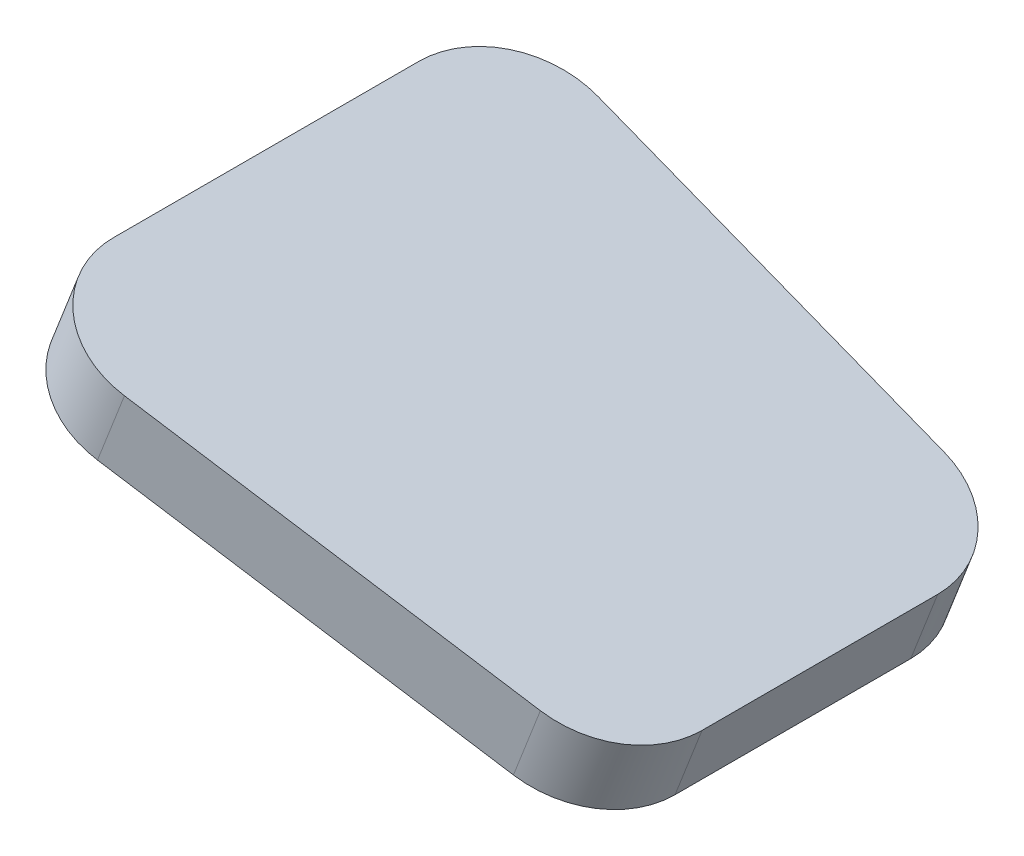
ISO-10303-21;
HEADER;
FILE_DESCRIPTION(('STEP AP214'),'2;1');
FILE_NAME('part.step','',(''),(''),'','','');
FILE_SCHEMA(('AUTOMOTIVE_DESIGN { 1 0 10303 214 1 1 1 1 }'));
ENDSEC;
DATA;
#1=APPLICATION_CONTEXT('core data for automotive mechanical design processes');
#2=APPLICATION_PROTOCOL_DEFINITION('international standard','automotive_design',2000,#1);
#3=PRODUCT_CONTEXT('',#1,'mechanical');
#4=PRODUCT('Part','Part','',(#3));
#5=PRODUCT_RELATED_PRODUCT_CATEGORY('part','',(#4));
#6=PRODUCT_DEFINITION_FORMATION('','',#4);
#7=PRODUCT_DEFINITION_CONTEXT('part definition',#1,'design');
#8=PRODUCT_DEFINITION('design','',#6,#7);
#9=PRODUCT_DEFINITION_SHAPE('','',#8);
#10=(LENGTH_UNIT() NAMED_UNIT(*) SI_UNIT(.MILLI.,.METRE.));
#11=(NAMED_UNIT(*) PLANE_ANGLE_UNIT() SI_UNIT($,.RADIAN.));
#12=(NAMED_UNIT(*) SI_UNIT($,.STERADIAN.) SOLID_ANGLE_UNIT());
#13=UNCERTAINTY_MEASURE_WITH_UNIT(LENGTH_MEASURE(1.E-05),#10,'distance_accuracy_value','');
#14=(GEOMETRIC_REPRESENTATION_CONTEXT(3) GLOBAL_UNCERTAINTY_ASSIGNED_CONTEXT((#13)) GLOBAL_UNIT_ASSIGNED_CONTEXT((#10,
#11,#12)) REPRESENTATION_CONTEXT('',''));
#15=CARTESIAN_POINT('',(0.,0.,0.));
#16=DIRECTION('',(0.,0.,1.));
#17=DIRECTION('',(1.,0.,0.));
#18=AXIS2_PLACEMENT_3D('',#15,#16,#17);
#19=CARTESIAN_POINT('',(-64.4236255865261,13.3464963099591,49.3421924891671));
#20=DIRECTION('',(-0.363059071754713,-0.931766124312644,0.));
#21=DIRECTION('',(0.931766124312644,-0.363059071754713,0.));
#22=AXIS2_PLACEMENT_3D('',#19,#20,#21);
#23=CYLINDRICAL_SURFACE('',#22,3.175);
#24=CARTESIAN_POINT('',(-65.3457956287831,10.979810354205,49.3421924891671));
#25=DIRECTION('',(0.363059071754713,0.931766124312644,0.));
#26=DIRECTION('',(-0.931766124312644,0.363059071754713,0.));
#27=AXIS2_PLACEMENT_3D('',#24,#25,#26);
#28=CIRCLE('',#27,3.175);
#29=CARTESIAN_POINT('',(-68.3041530734757,12.1325229070262,49.3421924891671));
#30=VERTEX_POINT('',#29);
#31=CARTESIAN_POINT('',(-64.7974936768709,10.7661666162451,52.4621838870334));
#32=VERTEX_POINT('',#31);
#33=EDGE_CURVE('E128',#30,#32,#28,.T.);
#34=ORIENTED_EDGE('',*,*,#33,.T.);
#35=DIRECTION('',(-0.363059071754713,-0.931766124312644,0.));
#36=VECTOR('',#35,1.);
#37=CARTESIAN_POINT('',(-63.8753236346139,13.1328525719993,52.4621838870334));
#38=LINE('',#37,#36);
#39=CARTESIAN_POINT('',(-63.8753236346139,13.1328525719993,52.4621838870334));
#40=VERTEX_POINT('',#39);
#41=EDGE_CURVE('E11',#40,#32,#38,.T.);
#42=ORIENTED_EDGE('',*,*,#41,.F.);
#43=CARTESIAN_POINT('',(-64.4236255865261,13.3464963099591,49.3421924891671));
#44=DIRECTION('',(0.363059071754713,0.931766124312644,0.));
#45=DIRECTION('',(-0.931766124312644,0.363059071754713,0.));
#46=AXIS2_PLACEMENT_3D('',#43,#44,#45);
#47=CIRCLE('',#46,3.175);
#48=CARTESIAN_POINT('',(-67.3819830312187,14.4992088627804,49.3421924891671));
#49=VERTEX_POINT('',#48);
#50=EDGE_CURVE('E142',#49,#40,#47,.T.);
#51=ORIENTED_EDGE('',*,*,#50,.F.);
#52=DIRECTION('',(-0.363059071754713,-0.931766124312644,0.));
#53=VECTOR('',#52,1.);
#54=CARTESIAN_POINT('',(-67.3819830312187,14.4992088627804,49.3421924891671));
#55=LINE('',#54,#53);
#56=EDGE_CURVE('E124',#49,#30,#55,.T.);
#57=ORIENTED_EDGE('',*,*,#56,.T.);
#58=EDGE_LOOP('',(#34,#42,#51,#57));
#59=FACE_BOUND('',#58,.T.);
#60=ADVANCED_FACE('F32',(#59),#23,.T.);
#61=CARTESIAN_POINT('',(-63.8753236346139,13.1328525719993,52.4621838870334));
#62=DIRECTION('',(-0.172693528161326,0.0672893662865768,-0.982674456020886));
#63=DIRECTION('',(-0.984906745104171,0.,0.173085826826776));
#64=AXIS2_PLACEMENT_3D('',#61,#62,#63);
#65=PLANE('',#64);
#66=DIRECTION('',(0.915622769347617,-0.35676887584001,-0.185339994291723));
#67=VECTOR('',#66,1.);
#68=CARTESIAN_POINT('',(-64.7974936768709,10.7661666162451,52.4621838870334));
#69=LINE('',#68,#67);
#70=CARTESIAN_POINT('',(-52.9640638981002,6.15531640496028,50.0668657701505));
#71=VERTEX_POINT('',#70);
#72=EDGE_CURVE('E131',#32,#71,#69,.T.);
#73=ORIENTED_EDGE('',*,*,#72,.T.);
#74=DIRECTION('',(-0.363059071754713,-0.931766124312644,0.));
#75=VECTOR('',#74,1.);
#76=CARTESIAN_POINT('',(-52.0418938558433,8.52200236071439,50.0668657701505));
#77=LINE('',#76,#75);
#78=CARTESIAN_POINT('',(-52.0418938558433,8.52200236071439,50.0668657701505));
#79=VERTEX_POINT('',#78);
#80=EDGE_CURVE('E40',#79,#71,#77,.T.);
#81=ORIENTED_EDGE('',*,*,#80,.F.);
#82=DIRECTION('',(0.915622769347617,-0.35676887584001,-0.185339994291723));
#83=VECTOR('',#82,1.);
#84=CARTESIAN_POINT('',(-63.8753236346139,13.1328525719993,52.4621838870334));
#85=LINE('',#84,#83);
#86=EDGE_CURVE('E91',#40,#79,#85,.T.);
#87=ORIENTED_EDGE('',*,*,#86,.F.);
#88=ORIENTED_EDGE('',*,*,#41,.T.);
#89=EDGE_LOOP('',(#73,#81,#87,#88));
#90=FACE_BOUND('',#89,.T.);
#91=ADVANCED_FACE('F177',(#90),#65,.F.);
#92=CARTESIAN_POINT('',(-52.5901958077555,8.73564609867428,46.9468743722842));
#93=DIRECTION('',(-0.363059071754713,-0.931766124312644,0.));
#94=DIRECTION('',(0.931766124312644,-0.363059071754713,0.));
#95=AXIS2_PLACEMENT_3D('',#92,#93,#94);
#96=CYLINDRICAL_SURFACE('',#95,3.17500000000001);
#97=CARTESIAN_POINT('',(-53.5123658500125,6.36896014292016,46.9468743722842));
#98=DIRECTION('',(0.363059071754713,0.931766124312644,0.));
#99=DIRECTION('',(-0.931766124312644,0.363059071754713,0.));
#100=AXIS2_PLACEMENT_3D('',#97,#98,#99);
#101=CIRCLE('',#100,3.17500000000001);
#102=CARTESIAN_POINT('',(-50.5540084053198,5.21624759009895,46.9468743722842));
#103=VERTEX_POINT('',#102);
#104=EDGE_CURVE('E133',#71,#103,#101,.T.);
#105=ORIENTED_EDGE('',*,*,#104,.T.);
#106=DIRECTION('',(-0.363059071754713,-0.931766124312644,0.));
#107=VECTOR('',#106,1.);
#108=CARTESIAN_POINT('',(-49.6318383630628,7.58293354585306,46.9468743722842));
#109=LINE('',#108,#107);
#110=CARTESIAN_POINT('',(-49.6318383630628,7.58293354585306,46.9468743722842));
#111=VERTEX_POINT('',#110);
#112=EDGE_CURVE('E149',#111,#103,#109,.T.);
#113=ORIENTED_EDGE('',*,*,#112,.F.);
#114=CARTESIAN_POINT('',(-52.5901958077555,8.73564609867428,46.9468743722842));
#115=DIRECTION('',(0.363059071754713,0.931766124312644,0.));
#116=DIRECTION('',(-0.931766124312644,0.363059071754713,0.));
#117=AXIS2_PLACEMENT_3D('',#114,#115,#116);
#118=CIRCLE('',#117,3.17500000000001);
#119=EDGE_CURVE('E157',#79,#111,#118,.T.);
#120=ORIENTED_EDGE('',*,*,#119,.F.);
#121=ORIENTED_EDGE('',*,*,#80,.T.);
#122=EDGE_LOOP('',(#105,#113,#120,#121));
#123=FACE_BOUND('',#122,.T.);
#124=ADVANCED_FACE('F155',(#123),#96,.T.);
#125=CARTESIAN_POINT('',(-49.6318383630628,7.58293354585306,46.9468743722842));
#126=DIRECTION('',(-0.931766124312644,0.363059071754713,0.));
#127=DIRECTION('',(-0.363059071754713,-0.931766124312644,0.));
#128=AXIS2_PLACEMENT_3D('',#125,#126,#127);
#129=PLANE('',#128);
#130=DIRECTION('',(0.,0.,-1.));
#131=VECTOR('',#130,1.);
#132=CARTESIAN_POINT('',(-50.5540084053198,5.21624759009895,46.9468743722842));
#133=LINE('',#132,#131);
#134=CARTESIAN_POINT('',(-50.5540084053198,5.21624759009895,38.8845004777816));
#135=VERTEX_POINT('',#134);
#136=EDGE_CURVE('E135',#103,#135,#133,.T.);
#137=ORIENTED_EDGE('',*,*,#136,.T.);
#138=DIRECTION('',(-0.363059071754713,-0.931766124312644,0.));
#139=VECTOR('',#138,1.);
#140=CARTESIAN_POINT('',(-49.6318383630628,7.58293354585306,38.8845004777816));
#141=LINE('',#140,#139);
#142=CARTESIAN_POINT('',(-49.6318383630628,7.58293354585306,38.8845004777816));
#143=VERTEX_POINT('',#142);
#144=EDGE_CURVE('E146',#143,#135,#141,.T.);
#145=ORIENTED_EDGE('',*,*,#144,.F.);
#146=DIRECTION('',(0.,0.,-1.));
#147=VECTOR('',#146,1.);
#148=CARTESIAN_POINT('',(-49.6318383630628,7.58293354585306,46.9468743722842));
#149=LINE('',#148,#147);
#150=EDGE_CURVE('E169',#111,#143,#149,.T.);
#151=ORIENTED_EDGE('',*,*,#150,.F.);
#152=ORIENTED_EDGE('',*,*,#112,.T.);
#153=EDGE_LOOP('',(#137,#145,#151,#152));
#154=FACE_BOUND('',#153,.T.);
#155=ADVANCED_FACE('F165',(#154),#129,.F.);
#156=CARTESIAN_POINT('',(-52.5901958077555,8.73564609867428,38.8845004777816));
#157=DIRECTION('',(-0.363059071754713,-0.931766124312644,0.));
#158=DIRECTION('',(0.931766124312644,-0.363059071754713,0.));
#159=AXIS2_PLACEMENT_3D('',#156,#157,#158);
#160=CYLINDRICAL_SURFACE('',#159,3.175);
#161=CARTESIAN_POINT('',(-53.5123658500125,6.36896014292016,38.8845004777816));
#162=DIRECTION('',(0.363059071754713,0.931766124312644,0.));
#163=DIRECTION('',(-0.931766124312644,0.363059071754713,0.));
#164=AXIS2_PLACEMENT_3D('',#161,#162,#163);
#165=CIRCLE('',#164,3.175);
#166=CARTESIAN_POINT('',(-53.5123658500125,6.36896014292016,35.7095004777816));
#167=VERTEX_POINT('',#166);
#168=EDGE_CURVE('E137',#135,#167,#165,.T.);
#169=ORIENTED_EDGE('',*,*,#168,.T.);
#170=DIRECTION('',(-0.363059071754713,-0.931766124312644,0.));
#171=VECTOR('',#170,1.);
#172=CARTESIAN_POINT('',(-52.5901958077555,8.73564609867428,35.7095004777816));
#173=LINE('',#172,#171);
#174=CARTESIAN_POINT('',(-52.5901958077555,8.73564609867428,35.7095004777816));
#175=VERTEX_POINT('',#174);
#176=EDGE_CURVE('E119',#175,#167,#173,.T.);
#177=ORIENTED_EDGE('',*,*,#176,.F.);
#178=CARTESIAN_POINT('',(-52.5901958077555,8.73564609867428,38.8845004777816));
#179=DIRECTION('',(0.363059071754713,0.931766124312644,0.));
#180=DIRECTION('',(-0.931766124312644,0.363059071754713,0.));
#181=AXIS2_PLACEMENT_3D('',#178,#179,#180);
#182=CIRCLE('',#181,3.175);
#183=EDGE_CURVE('E110',#143,#175,#182,.T.);
#184=ORIENTED_EDGE('',*,*,#183,.F.);
#185=ORIENTED_EDGE('',*,*,#144,.T.);
#186=EDGE_LOOP('',(#169,#177,#184,#185));
#187=FACE_BOUND('',#186,.T.);
#188=ADVANCED_FACE('F168',(#187),#160,.T.);
#189=CARTESIAN_POINT('',(-52.5901958077555,8.73564609867428,35.7095004777816));
#190=DIRECTION('',(0.,0.,1.));
#191=DIRECTION('',(1.,0.,0.));
#192=AXIS2_PLACEMENT_3D('',#189,#190,#191);
#193=PLANE('',#192);
#194=DIRECTION('',(-0.931766124312644,0.363059071754713,0.));
#195=VECTOR('',#194,1.);
#196=CARTESIAN_POINT('',(-53.5123658500125,6.36896014292016,35.7095004777816));
#197=LINE('',#196,#195);
#198=CARTESIAN_POINT('',(-65.3457956287831,10.979810354205,35.7095004777816));
#199=VERTEX_POINT('',#198);
#200=EDGE_CURVE('E118',#167,#199,#197,.T.);
#201=ORIENTED_EDGE('',*,*,#200,.T.);
#202=DIRECTION('',(-0.363059071754713,-0.931766124312644,0.));
#203=VECTOR('',#202,1.);
#204=CARTESIAN_POINT('',(-64.4236255865261,13.3464963099591,35.7095004777816));
#205=LINE('',#204,#203);
#206=CARTESIAN_POINT('',(-64.4236255865261,13.3464963099591,35.7095004777816));
#207=VERTEX_POINT('',#206);
#208=EDGE_CURVE('E115',#207,#199,#205,.T.);
#209=ORIENTED_EDGE('',*,*,#208,.F.);
#210=DIRECTION('',(-0.931766124312644,0.363059071754713,0.));
#211=VECTOR('',#210,1.);
#212=CARTESIAN_POINT('',(-52.5901958077555,8.73564609867428,35.7095004777816));
#213=LINE('',#212,#211);
#214=EDGE_CURVE('E104',#175,#207,#213,.T.);
#215=ORIENTED_EDGE('',*,*,#214,.F.);
#216=ORIENTED_EDGE('',*,*,#176,.T.);
#217=EDGE_LOOP('',(#201,#209,#215,#216));
#218=FACE_BOUND('',#217,.T.);
#219=ADVANCED_FACE('F116',(#218),#193,.F.);
#220=CARTESIAN_POINT('',(-64.4236255865261,13.3464963099591,38.8845004777816));
#221=DIRECTION('',(-0.363059071754713,-0.931766124312644,0.));
#222=DIRECTION('',(0.931766124312644,-0.363059071754713,0.));
#223=AXIS2_PLACEMENT_3D('',#220,#221,#222);
#224=CYLINDRICAL_SURFACE('',#223,3.17500000000001);
#225=CARTESIAN_POINT('',(-65.345795628783,10.979810354205,38.8845004777816));
#226=DIRECTION('',(0.363059071754713,0.931766124312644,0.));
#227=DIRECTION('',(-0.931766124312644,0.363059071754713,0.));
#228=AXIS2_PLACEMENT_3D('',#225,#226,#227);
#229=CIRCLE('',#228,3.17500000000001);
#230=CARTESIAN_POINT('',(-68.3041530734757,12.1325229070262,38.8845004777816));
#231=VERTEX_POINT('',#230);
#232=EDGE_CURVE('E77',#199,#231,#229,.T.);
#233=ORIENTED_EDGE('',*,*,#232,.T.);
#234=DIRECTION('',(-0.363059071754713,-0.931766124312644,0.));
#235=VECTOR('',#234,1.);
#236=CARTESIAN_POINT('',(-67.3819830312187,14.4992088627804,38.8845004777816));
#237=LINE('',#236,#235);
#238=CARTESIAN_POINT('',(-67.3819830312187,14.4992088627804,38.8845004777816));
#239=VERTEX_POINT('',#238);
#240=EDGE_CURVE('E120',#239,#231,#237,.T.);
#241=ORIENTED_EDGE('',*,*,#240,.F.);
#242=CARTESIAN_POINT('',(-64.4236255865261,13.3464963099591,38.8845004777816));
#243=DIRECTION('',(0.363059071754713,0.931766124312644,0.));
#244=DIRECTION('',(-0.931766124312644,0.363059071754713,0.));
#245=AXIS2_PLACEMENT_3D('',#242,#243,#244);
#246=CIRCLE('',#245,3.17500000000001);
#247=EDGE_CURVE('E108',#207,#239,#246,.T.);
#248=ORIENTED_EDGE('',*,*,#247,.F.);
#249=ORIENTED_EDGE('',*,*,#208,.T.);
#250=EDGE_LOOP('',(#233,#241,#248,#249));
#251=FACE_BOUND('',#250,.T.);
#252=ADVANCED_FACE('F122',(#251),#224,.T.);
#253=CARTESIAN_POINT('',(-67.3819830312187,14.4992088627804,38.8845004777816));
#254=DIRECTION('',(0.931766124312644,-0.363059071754713,0.));
#255=DIRECTION('',(0.363059071754713,0.931766124312644,0.));
#256=AXIS2_PLACEMENT_3D('',#253,#254,#255);
#257=PLANE('',#256);
#258=DIRECTION('',(0.,0.,1.));
#259=VECTOR('',#258,1.);
#260=CARTESIAN_POINT('',(-68.3041530734757,12.1325229070262,38.8845004777816));
#261=LINE('',#260,#259);
#262=EDGE_CURVE('E83',#231,#30,#261,.T.);
#263=ORIENTED_EDGE('',*,*,#262,.T.);
#264=ORIENTED_EDGE('',*,*,#56,.F.);
#265=DIRECTION('',(0.,0.,1.));
#266=VECTOR('',#265,1.);
#267=CARTESIAN_POINT('',(-67.3819830312187,14.4992088627804,38.8845004777816));
#268=LINE('',#267,#266);
#269=EDGE_CURVE('E48',#239,#49,#268,.T.);
#270=ORIENTED_EDGE('',*,*,#269,.F.);
#271=ORIENTED_EDGE('',*,*,#240,.T.);
#272=EDGE_LOOP('',(#263,#264,#270,#271));
#273=FACE_BOUND('',#272,.T.);
#274=ADVANCED_FACE('F193',(#273),#257,.F.);
#275=CARTESIAN_POINT('',(-64.4236255865261,13.3464963099591,49.3421924891671));
#276=DIRECTION('',(0.363059071754713,0.931766124312644,0.));
#277=DIRECTION('',(-0.931766124312644,0.363059071754713,0.));
#278=AXIS2_PLACEMENT_3D('',#275,#276,#277);
#279=PLANE('',#278);
#280=ORIENTED_EDGE('',*,*,#50,.T.);
#281=ORIENTED_EDGE('',*,*,#86,.T.);
#282=ORIENTED_EDGE('',*,*,#119,.T.);
#283=ORIENTED_EDGE('',*,*,#150,.T.);
#284=ORIENTED_EDGE('',*,*,#183,.T.);
#285=ORIENTED_EDGE('',*,*,#214,.T.);
#286=ORIENTED_EDGE('',*,*,#247,.T.);
#287=ORIENTED_EDGE('',*,*,#269,.T.);
#288=EDGE_LOOP('',(#280,#281,#282,#283,#284,#285,#286,#287));
#289=FACE_BOUND('',#288,.T.);
#290=ADVANCED_FACE('F106',(#289),#279,.T.);
#291=CARTESIAN_POINT('',(-65.3457956287831,10.979810354205,49.3421924891671));
#292=DIRECTION('',(0.363059071754713,0.931766124312644,0.));
#293=DIRECTION('',(-0.931766124312644,0.363059071754713,0.));
#294=AXIS2_PLACEMENT_3D('',#291,#292,#293);
#295=PLANE('',#294);
#296=ORIENTED_EDGE('',*,*,#33,.F.);
#297=ORIENTED_EDGE('',*,*,#262,.F.);
#298=ORIENTED_EDGE('',*,*,#232,.F.);
#299=ORIENTED_EDGE('',*,*,#200,.F.);
#300=ORIENTED_EDGE('',*,*,#168,.F.);
#301=ORIENTED_EDGE('',*,*,#136,.F.);
#302=ORIENTED_EDGE('',*,*,#104,.F.);
#303=ORIENTED_EDGE('',*,*,#72,.F.);
#304=EDGE_LOOP('',(#296,#297,#298,#299,#300,#301,#302,#303));
#305=FACE_BOUND('',#304,.T.);
#306=ADVANCED_FACE('F161',(#305),#295,.F.);
#307=CLOSED_SHELL('',(#60,#91,#124,#155,#188,#219,#252,#274,#290,#306));
#308=MANIFOLD_SOLID_BREP('B2',#307);
#309=ADVANCED_BREP_SHAPE_REPRESENTATION('',(#18,#308),#14);
#310=SHAPE_DEFINITION_REPRESENTATION(#9,#309);
ENDSEC;
END-ISO-10303-21;
